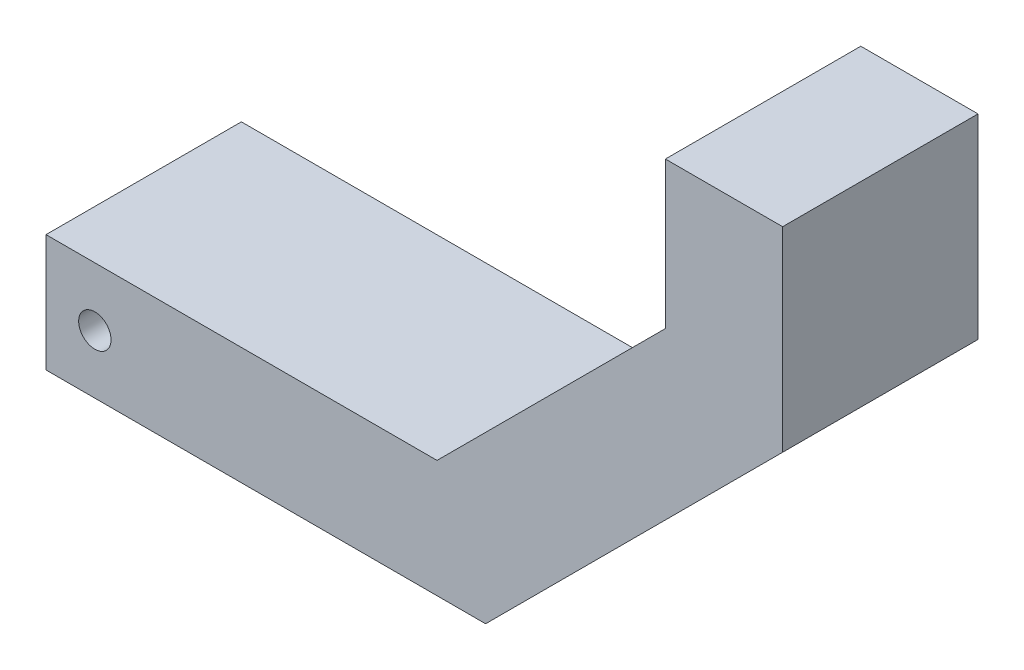
ISO-10303-21;
HEADER;
FILE_DESCRIPTION(('STEP AP214'),'2;1');
FILE_NAME('part.step','',(''),(''),'','','');
FILE_SCHEMA(('AUTOMOTIVE_DESIGN { 1 0 10303 214 1 1 1 1 }'));
ENDSEC;
DATA;
#1=APPLICATION_CONTEXT('core data for automotive mechanical design processes');
#2=APPLICATION_PROTOCOL_DEFINITION('international standard','automotive_design',2000,#1);
#3=PRODUCT_CONTEXT('',#1,'mechanical');
#4=PRODUCT('Part','Part','',(#3));
#5=PRODUCT_RELATED_PRODUCT_CATEGORY('part','',(#4));
#6=PRODUCT_DEFINITION_FORMATION('','',#4);
#7=PRODUCT_DEFINITION_CONTEXT('part definition',#1,'design');
#8=PRODUCT_DEFINITION('design','',#6,#7);
#9=PRODUCT_DEFINITION_SHAPE('','',#8);
#10=(LENGTH_UNIT() NAMED_UNIT(*) SI_UNIT(.MILLI.,.METRE.));
#11=(NAMED_UNIT(*) PLANE_ANGLE_UNIT() SI_UNIT($,.RADIAN.));
#12=(NAMED_UNIT(*) SI_UNIT($,.STERADIAN.) SOLID_ANGLE_UNIT());
#13=UNCERTAINTY_MEASURE_WITH_UNIT(LENGTH_MEASURE(1.E-05),#10,'distance_accuracy_value','');
#14=(GEOMETRIC_REPRESENTATION_CONTEXT(3) GLOBAL_UNCERTAINTY_ASSIGNED_CONTEXT((#13)) GLOBAL_UNIT_ASSIGNED_CONTEXT((#10,
#11,#12)) REPRESENTATION_CONTEXT('',''));
#15=CARTESIAN_POINT('',(0.,0.,0.));
#16=DIRECTION('',(0.,0.,1.));
#17=DIRECTION('',(1.,0.,0.));
#18=AXIS2_PLACEMENT_3D('',#15,#16,#17);
#19=CARTESIAN_POINT('',(0.,0.,20.));
#20=DIRECTION('',(0.,0.,1.));
#21=DIRECTION('',(1.,0.,0.));
#22=AXIS2_PLACEMENT_3D('',#19,#20,#21);
#23=PLANE('',#22);
#24=DIRECTION('',(0.,-1.,0.));
#25=VECTOR('',#24,1.);
#26=CARTESIAN_POINT('',(0.,12.,20.));
#27=LINE('',#26,#25);
#28=CARTESIAN_POINT('',(0.,12.,20.));
#29=VERTEX_POINT('',#28);
#30=CARTESIAN_POINT('',(0.,0.,20.));
#31=VERTEX_POINT('',#30);
#32=EDGE_CURVE('E145',#29,#31,#27,.T.);
#33=ORIENTED_EDGE('',*,*,#32,.T.);
#34=DIRECTION('',(1.,0.,0.));
#35=VECTOR('',#34,1.);
#36=CARTESIAN_POINT('',(0.,0.,20.));
#37=LINE('',#36,#35);
#38=CARTESIAN_POINT('',(45.,0.,20.));
#39=VERTEX_POINT('',#38);
#40=EDGE_CURVE('E93',#31,#39,#37,.T.);
#41=ORIENTED_EDGE('',*,*,#40,.T.);
#42=DIRECTION('',(0.707106781186546,0.707106781186549,0.));
#43=VECTOR('',#42,1.);
#44=CARTESIAN_POINT('',(45.,0.,20.));
#45=LINE('',#44,#43);
#46=CARTESIAN_POINT('',(75.4055915910215,30.4055915910216,20.));
#47=VERTEX_POINT('',#46);
#48=EDGE_CURVE('E160',#39,#47,#45,.T.);
#49=ORIENTED_EDGE('',*,*,#48,.T.);
#50=DIRECTION('',(0.,1.,0.));
#51=VECTOR('',#50,1.);
#52=CARTESIAN_POINT('',(75.4055915910215,30.4055915910216,20.));
#53=LINE('',#52,#51);
#54=CARTESIAN_POINT('',(75.4055915910214,50.4055915910216,20.));
#55=VERTEX_POINT('',#54);
#56=EDGE_CURVE('E173',#47,#55,#53,.T.);
#57=ORIENTED_EDGE('',*,*,#56,.T.);
#58=DIRECTION('',(-1.,0.,0.));
#59=VECTOR('',#58,1.);
#60=CARTESIAN_POINT('',(63.4055915910214,50.4055915910215,20.));
#61=LINE('',#60,#59);
#62=CARTESIAN_POINT('',(63.4055915910214,50.4055915910215,20.));
#63=VERTEX_POINT('',#62);
#64=EDGE_CURVE('E112',#55,#63,#61,.T.);
#65=ORIENTED_EDGE('',*,*,#64,.T.);
#66=DIRECTION('',(0.,-1.,0.));
#67=VECTOR('',#66,1.);
#68=CARTESIAN_POINT('',(63.4055915910215,35.3761543394986,20.));
#69=LINE('',#68,#67);
#70=CARTESIAN_POINT('',(63.4055915910215,35.3761543394986,20.));
#71=VERTEX_POINT('',#70);
#72=EDGE_CURVE('E106',#63,#71,#69,.T.);
#73=ORIENTED_EDGE('',*,*,#72,.T.);
#74=DIRECTION('',(-0.707106781186547,-0.707106781186547,0.));
#75=VECTOR('',#74,1.);
#76=CARTESIAN_POINT('',(40.0294372515229,12.,20.));
#77=LINE('',#76,#75);
#78=CARTESIAN_POINT('',(40.0294372515229,12.,20.));
#79=VERTEX_POINT('',#78);
#80=EDGE_CURVE('E110',#71,#79,#77,.T.);
#81=ORIENTED_EDGE('',*,*,#80,.T.);
#82=DIRECTION('',(-1.,0.,0.));
#83=VECTOR('',#82,1.);
#84=CARTESIAN_POINT('',(0.,12.,20.));
#85=LINE('',#84,#83);
#86=EDGE_CURVE('E50',#79,#29,#85,.T.);
#87=ORIENTED_EDGE('',*,*,#86,.T.);
#88=EDGE_LOOP('',(#33,#41,#49,#57,#65,#73,#81,#87));
#89=FACE_BOUND('',#88,.T.);
#90=CARTESIAN_POINT('',(5.,6.,20.));
#91=DIRECTION('',(0.,0.,1.));
#92=DIRECTION('',(1.,0.,0.));
#93=AXIS2_PLACEMENT_3D('',#90,#91,#92);
#94=CIRCLE('',#93,1.65788428860652);
#95=CARTESIAN_POINT('',(6.65788428860652,6.,20.));
#96=VERTEX_POINT('',#95);
#97=EDGE_CURVE('E134',#96,#96,#94,.T.);
#98=ORIENTED_EDGE('',*,*,#97,.F.);
#99=EDGE_LOOP('',(#98));
#100=FACE_BOUND('',#99,.T.);
#101=ADVANCED_FACE('F33',(#89,#100),#23,.T.);
#102=CARTESIAN_POINT('',(0.,0.,0.));
#103=DIRECTION('',(0.,0.,1.));
#104=DIRECTION('',(1.,0.,0.));
#105=AXIS2_PLACEMENT_3D('',#102,#103,#104);
#106=PLANE('',#105);
#107=DIRECTION('',(0.,-1.,0.));
#108=VECTOR('',#107,1.);
#109=CARTESIAN_POINT('',(0.,12.,0.));
#110=LINE('',#109,#108);
#111=CARTESIAN_POINT('',(0.,12.,0.));
#112=VERTEX_POINT('',#111);
#113=CARTESIAN_POINT('',(0.,0.,0.));
#114=VERTEX_POINT('',#113);
#115=EDGE_CURVE('E130',#112,#114,#110,.T.);
#116=ORIENTED_EDGE('',*,*,#115,.F.);
#117=DIRECTION('',(-1.,0.,0.));
#118=VECTOR('',#117,1.);
#119=CARTESIAN_POINT('',(0.,12.,0.));
#120=LINE('',#119,#118);
#121=CARTESIAN_POINT('',(40.0294372515229,12.,0.));
#122=VERTEX_POINT('',#121);
#123=EDGE_CURVE('E85',#122,#112,#120,.T.);
#124=ORIENTED_EDGE('',*,*,#123,.F.);
#125=DIRECTION('',(-0.707106781186547,-0.707106781186547,0.));
#126=VECTOR('',#125,1.);
#127=CARTESIAN_POINT('',(40.0294372515229,12.,0.));
#128=LINE('',#127,#126);
#129=CARTESIAN_POINT('',(63.4055915910215,35.3761543394986,0.));
#130=VERTEX_POINT('',#129);
#131=EDGE_CURVE('E79',#130,#122,#128,.T.);
#132=ORIENTED_EDGE('',*,*,#131,.F.);
#133=DIRECTION('',(0.,-1.,0.));
#134=VECTOR('',#133,1.);
#135=CARTESIAN_POINT('',(63.4055915910215,35.3761543394986,0.));
#136=LINE('',#135,#134);
#137=CARTESIAN_POINT('',(63.4055915910214,50.4055915910215,0.));
#138=VERTEX_POINT('',#137);
#139=EDGE_CURVE('E120',#138,#130,#136,.T.);
#140=ORIENTED_EDGE('',*,*,#139,.F.);
#141=DIRECTION('',(-1.,0.,0.));
#142=VECTOR('',#141,1.);
#143=CARTESIAN_POINT('',(63.4055915910214,50.4055915910215,0.));
#144=LINE('',#143,#142);
#145=CARTESIAN_POINT('',(75.4055915910214,50.4055915910216,0.));
#146=VERTEX_POINT('',#145);
#147=EDGE_CURVE('E140',#146,#138,#144,.T.);
#148=ORIENTED_EDGE('',*,*,#147,.F.);
#149=DIRECTION('',(0.,1.,0.));
#150=VECTOR('',#149,1.);
#151=CARTESIAN_POINT('',(75.4055915910215,30.4055915910216,0.));
#152=LINE('',#151,#150);
#153=CARTESIAN_POINT('',(75.4055915910215,30.4055915910216,0.));
#154=VERTEX_POINT('',#153);
#155=EDGE_CURVE('E138',#154,#146,#152,.T.);
#156=ORIENTED_EDGE('',*,*,#155,.F.);
#157=DIRECTION('',(0.707106781186546,0.707106781186549,0.));
#158=VECTOR('',#157,1.);
#159=CARTESIAN_POINT('',(45.,0.,0.));
#160=LINE('',#159,#158);
#161=CARTESIAN_POINT('',(45.,0.,0.));
#162=VERTEX_POINT('',#161);
#163=EDGE_CURVE('E136',#162,#154,#160,.T.);
#164=ORIENTED_EDGE('',*,*,#163,.F.);
#165=DIRECTION('',(1.,0.,0.));
#166=VECTOR('',#165,1.);
#167=CARTESIAN_POINT('',(0.,0.,0.));
#168=LINE('',#167,#166);
#169=EDGE_CURVE('E133',#114,#162,#168,.T.);
#170=ORIENTED_EDGE('',*,*,#169,.F.);
#171=EDGE_LOOP('',(#116,#124,#132,#140,#148,#156,#164,#170));
#172=FACE_BOUND('',#171,.T.);
#173=CARTESIAN_POINT('',(5.,6.,0.));
#174=DIRECTION('',(0.,0.,1.));
#175=DIRECTION('',(1.,0.,0.));
#176=AXIS2_PLACEMENT_3D('',#173,#174,#175);
#177=CIRCLE('',#176,1.65788428860652);
#178=CARTESIAN_POINT('',(6.65788428860652,6.,0.));
#179=VERTEX_POINT('',#178);
#180=EDGE_CURVE('E179',#179,#179,#177,.T.);
#181=ORIENTED_EDGE('',*,*,#180,.T.);
#182=EDGE_LOOP('',(#181));
#183=FACE_BOUND('',#182,.T.);
#184=ADVANCED_FACE('F164',(#172,#183),#106,.F.);
#185=CARTESIAN_POINT('',(0.,12.,20.));
#186=DIRECTION('',(1.,0.,0.));
#187=DIRECTION('',(0.,0.,-1.));
#188=AXIS2_PLACEMENT_3D('',#185,#186,#187);
#189=PLANE('',#188);
#190=ORIENTED_EDGE('',*,*,#115,.T.);
#191=DIRECTION('',(0.,0.,-1.));
#192=VECTOR('',#191,1.);
#193=CARTESIAN_POINT('',(0.,0.,20.));
#194=LINE('',#193,#192);
#195=EDGE_CURVE('E11',#31,#114,#194,.T.);
#196=ORIENTED_EDGE('',*,*,#195,.F.);
#197=ORIENTED_EDGE('',*,*,#32,.F.);
#198=DIRECTION('',(0.,0.,-1.));
#199=VECTOR('',#198,1.);
#200=CARTESIAN_POINT('',(0.,12.,20.));
#201=LINE('',#200,#199);
#202=EDGE_CURVE('E126',#29,#112,#201,.T.);
#203=ORIENTED_EDGE('',*,*,#202,.T.);
#204=EDGE_LOOP('',(#190,#196,#197,#203));
#205=FACE_BOUND('',#204,.T.);
#206=ADVANCED_FACE('F35',(#205),#189,.F.);
#207=CARTESIAN_POINT('',(0.,0.,20.));
#208=DIRECTION('',(0.,1.,0.));
#209=DIRECTION('',(0.,0.,1.));
#210=AXIS2_PLACEMENT_3D('',#207,#208,#209);
#211=PLANE('',#210);
#212=ORIENTED_EDGE('',*,*,#169,.T.);
#213=DIRECTION('',(0.,0.,-1.));
#214=VECTOR('',#213,1.);
#215=CARTESIAN_POINT('',(45.,0.,20.));
#216=LINE('',#215,#214);
#217=EDGE_CURVE('E42',#39,#162,#216,.T.);
#218=ORIENTED_EDGE('',*,*,#217,.F.);
#219=ORIENTED_EDGE('',*,*,#40,.F.);
#220=ORIENTED_EDGE('',*,*,#195,.T.);
#221=EDGE_LOOP('',(#212,#218,#219,#220));
#222=FACE_BOUND('',#221,.T.);
#223=ADVANCED_FACE('F207',(#222),#211,.F.);
#224=CARTESIAN_POINT('',(45.,0.,20.));
#225=DIRECTION('',(-0.707106781186549,0.707106781186546,0.));
#226=DIRECTION('',(-0.707106781186546,-0.707106781186549,0.));
#227=AXIS2_PLACEMENT_3D('',#224,#225,#226);
#228=PLANE('',#227);
#229=ORIENTED_EDGE('',*,*,#163,.T.);
#230=DIRECTION('',(0.,0.,-1.));
#231=VECTOR('',#230,1.);
#232=CARTESIAN_POINT('',(75.4055915910215,30.4055915910216,20.));
#233=LINE('',#232,#231);
#234=EDGE_CURVE('E152',#47,#154,#233,.T.);
#235=ORIENTED_EDGE('',*,*,#234,.F.);
#236=ORIENTED_EDGE('',*,*,#48,.F.);
#237=ORIENTED_EDGE('',*,*,#217,.T.);
#238=EDGE_LOOP('',(#229,#235,#236,#237));
#239=FACE_BOUND('',#238,.T.);
#240=ADVANCED_FACE('F158',(#239),#228,.F.);
#241=CARTESIAN_POINT('',(75.4055915910215,30.4055915910216,20.));
#242=DIRECTION('',(-1.,0.,0.));
#243=DIRECTION('',(0.,-1.,0.));
#244=AXIS2_PLACEMENT_3D('',#241,#242,#243);
#245=PLANE('',#244);
#246=ORIENTED_EDGE('',*,*,#155,.T.);
#247=DIRECTION('',(0.,0.,-1.));
#248=VECTOR('',#247,1.);
#249=CARTESIAN_POINT('',(75.4055915910214,50.4055915910216,20.));
#250=LINE('',#249,#248);
#251=EDGE_CURVE('E149',#55,#146,#250,.T.);
#252=ORIENTED_EDGE('',*,*,#251,.F.);
#253=ORIENTED_EDGE('',*,*,#56,.F.);
#254=ORIENTED_EDGE('',*,*,#234,.T.);
#255=EDGE_LOOP('',(#246,#252,#253,#254));
#256=FACE_BOUND('',#255,.T.);
#257=ADVANCED_FACE('F169',(#256),#245,.F.);
#258=CARTESIAN_POINT('',(63.4055915910214,50.4055915910215,20.));
#259=DIRECTION('',(0.,-1.,0.));
#260=DIRECTION('',(1.,0.,0.));
#261=AXIS2_PLACEMENT_3D('',#258,#259,#260);
#262=PLANE('',#261);
#263=ORIENTED_EDGE('',*,*,#147,.T.);
#264=DIRECTION('',(0.,0.,-1.));
#265=VECTOR('',#264,1.);
#266=CARTESIAN_POINT('',(63.4055915910214,50.4055915910215,20.));
#267=LINE('',#266,#265);
#268=EDGE_CURVE('E121',#63,#138,#267,.T.);
#269=ORIENTED_EDGE('',*,*,#268,.F.);
#270=ORIENTED_EDGE('',*,*,#64,.F.);
#271=ORIENTED_EDGE('',*,*,#251,.T.);
#272=EDGE_LOOP('',(#263,#269,#270,#271));
#273=FACE_BOUND('',#272,.T.);
#274=ADVANCED_FACE('F172',(#273),#262,.F.);
#275=CARTESIAN_POINT('',(63.4055915910215,35.3761543394986,20.));
#276=DIRECTION('',(1.,0.,0.));
#277=DIRECTION('',(0.,1.,0.));
#278=AXIS2_PLACEMENT_3D('',#275,#276,#277);
#279=PLANE('',#278);
#280=ORIENTED_EDGE('',*,*,#139,.T.);
#281=DIRECTION('',(0.,0.,-1.));
#282=VECTOR('',#281,1.);
#283=CARTESIAN_POINT('',(63.4055915910215,35.3761543394986,20.));
#284=LINE('',#283,#282);
#285=EDGE_CURVE('E117',#71,#130,#284,.T.);
#286=ORIENTED_EDGE('',*,*,#285,.F.);
#287=ORIENTED_EDGE('',*,*,#72,.F.);
#288=ORIENTED_EDGE('',*,*,#268,.T.);
#289=EDGE_LOOP('',(#280,#286,#287,#288));
#290=FACE_BOUND('',#289,.T.);
#291=ADVANCED_FACE('F118',(#290),#279,.F.);
#292=CARTESIAN_POINT('',(40.0294372515229,12.,20.));
#293=DIRECTION('',(0.707106781186547,-0.707106781186548,0.));
#294=DIRECTION('',(0.707106781186548,0.707106781186547,0.));
#295=AXIS2_PLACEMENT_3D('',#292,#293,#294);
#296=PLANE('',#295);
#297=ORIENTED_EDGE('',*,*,#131,.T.);
#298=DIRECTION('',(0.,0.,-1.));
#299=VECTOR('',#298,1.);
#300=CARTESIAN_POINT('',(40.0294372515229,12.,20.));
#301=LINE('',#300,#299);
#302=EDGE_CURVE('E122',#79,#122,#301,.T.);
#303=ORIENTED_EDGE('',*,*,#302,.F.);
#304=ORIENTED_EDGE('',*,*,#80,.F.);
#305=ORIENTED_EDGE('',*,*,#285,.T.);
#306=EDGE_LOOP('',(#297,#303,#304,#305));
#307=FACE_BOUND('',#306,.T.);
#308=ADVANCED_FACE('F124',(#307),#296,.F.);
#309=CARTESIAN_POINT('',(0.,12.,20.));
#310=DIRECTION('',(0.,-1.,0.));
#311=DIRECTION('',(0.,0.,-1.));
#312=AXIS2_PLACEMENT_3D('',#309,#310,#311);
#313=PLANE('',#312);
#314=ORIENTED_EDGE('',*,*,#123,.T.);
#315=ORIENTED_EDGE('',*,*,#202,.F.);
#316=ORIENTED_EDGE('',*,*,#86,.F.);
#317=ORIENTED_EDGE('',*,*,#302,.T.);
#318=EDGE_LOOP('',(#314,#315,#316,#317));
#319=FACE_BOUND('',#318,.T.);
#320=ADVANCED_FACE('F195',(#319),#313,.F.);
#321=CARTESIAN_POINT('',(5.,6.,20.));
#322=DIRECTION('',(0.,0.,-1.));
#323=DIRECTION('',(-1.,0.,0.));
#324=AXIS2_PLACEMENT_3D('',#321,#322,#323);
#325=CYLINDRICAL_SURFACE('',#324,1.65788428860652);
#326=ORIENTED_EDGE('',*,*,#97,.T.);
#327=EDGE_LOOP('',(#326));
#328=FACE_BOUND('',#327,.T.);
#329=ORIENTED_EDGE('',*,*,#180,.F.);
#330=EDGE_LOOP('',(#329));
#331=FACE_BOUND('',#330,.T.);
#332=ADVANCED_FACE('F185',(#328,#331),#325,.F.);
#333=CLOSED_SHELL('',(#101,#184,#206,#223,#240,#257,#274,#291,#308,#320,#332));
#334=MANIFOLD_SOLID_BREP('B2',#333);
#335=ADVANCED_BREP_SHAPE_REPRESENTATION('',(#18,#334),#14);
#336=SHAPE_DEFINITION_REPRESENTATION(#9,#335);
ENDSEC;
END-ISO-10303-21;
